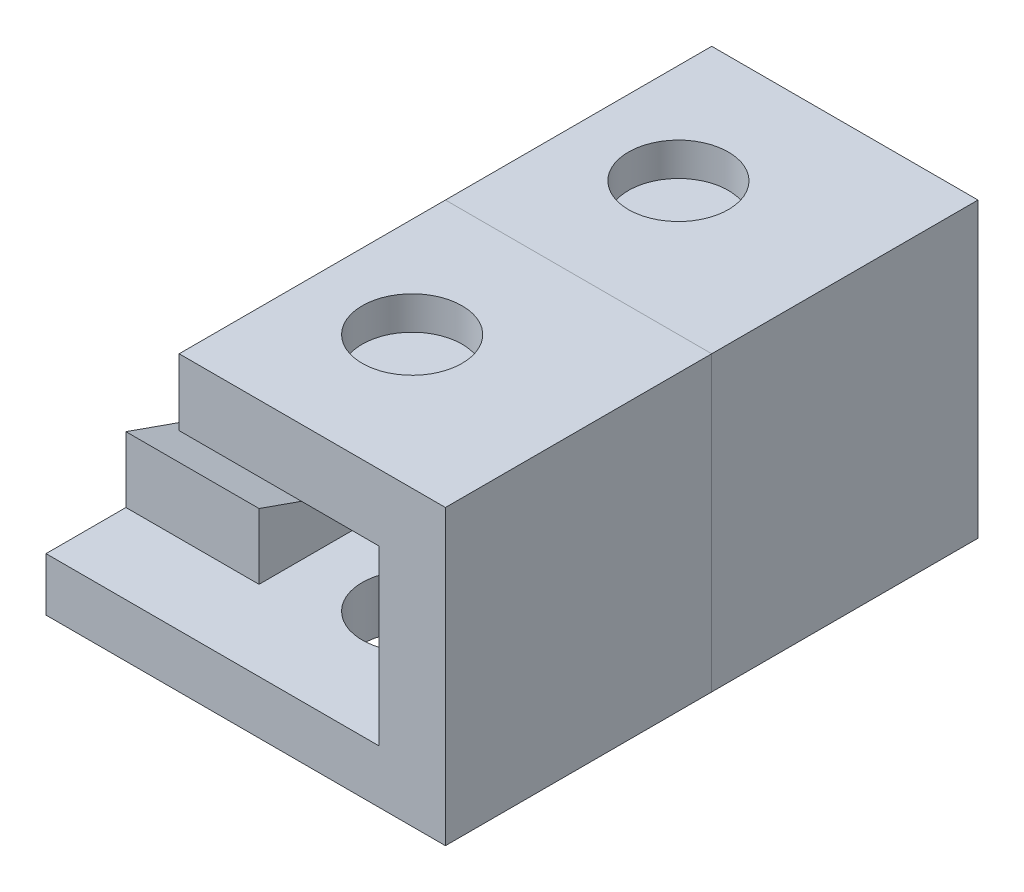
ISO-10303-21;
HEADER;
FILE_DESCRIPTION(('STEP AP214'),'2;1');
FILE_NAME('part.step','',(''),(''),'','','');
FILE_SCHEMA(('AUTOMOTIVE_DESIGN { 1 0 10303 214 1 1 1 1 }'));
ENDSEC;
DATA;
#1=APPLICATION_CONTEXT('core data for automotive mechanical design processes');
#2=APPLICATION_PROTOCOL_DEFINITION('international standard','automotive_design',2000,#1);
#3=PRODUCT_CONTEXT('',#1,'mechanical');
#4=PRODUCT('Part','Part','',(#3));
#5=PRODUCT_RELATED_PRODUCT_CATEGORY('part','',(#4));
#6=PRODUCT_DEFINITION_FORMATION('','',#4);
#7=PRODUCT_DEFINITION_CONTEXT('part definition',#1,'design');
#8=PRODUCT_DEFINITION('design','',#6,#7);
#9=PRODUCT_DEFINITION_SHAPE('','',#8);
#10=(LENGTH_UNIT() NAMED_UNIT(*) SI_UNIT(.MILLI.,.METRE.));
#11=(NAMED_UNIT(*) PLANE_ANGLE_UNIT() SI_UNIT($,.RADIAN.));
#12=(NAMED_UNIT(*) SI_UNIT($,.STERADIAN.) SOLID_ANGLE_UNIT());
#13=UNCERTAINTY_MEASURE_WITH_UNIT(LENGTH_MEASURE(1.E-05),#10,'distance_accuracy_value','');
#14=(GEOMETRIC_REPRESENTATION_CONTEXT(3) GLOBAL_UNCERTAINTY_ASSIGNED_CONTEXT((#13)) GLOBAL_UNIT_ASSIGNED_CONTEXT((#10,
#11,#12)) REPRESENTATION_CONTEXT('',''));
#15=CARTESIAN_POINT('',(0.,0.,0.));
#16=DIRECTION('',(0.,0.,1.));
#17=DIRECTION('',(1.,0.,0.));
#18=AXIS2_PLACEMENT_3D('',#15,#16,#17);
#19=CARTESIAN_POINT('',(31.75,-2.54,0.));
#20=DIRECTION('',(1.,0.,0.));
#21=DIRECTION('',(0.,0.,1.));
#22=AXIS2_PLACEMENT_3D('',#19,#20,#21);
#23=PLANE('',#22);
#24=DIRECTION('',(0.,0.,-1.));
#25=VECTOR('',#24,1.);
#26=CARTESIAN_POINT('',(31.75,19.05,25.4));
#27=LINE('',#26,#25);
#28=CARTESIAN_POINT('',(31.75,19.05,25.4));
#29=VERTEX_POINT('',#28);
#30=CARTESIAN_POINT('',(31.75,19.05,0.));
#31=VERTEX_POINT('',#30);
#32=EDGE_CURVE('E205',#29,#31,#27,.T.);
#33=ORIENTED_EDGE('',*,*,#32,.T.);
#34=DIRECTION('',(0.,1.,0.));
#35=VECTOR('',#34,1.);
#36=CARTESIAN_POINT('',(31.75,-2.54,0.));
#37=LINE('',#36,#35);
#38=CARTESIAN_POINT('',(31.75,2.54,0.));
#39=VERTEX_POINT('',#38);
#40=EDGE_CURVE('E239',#39,#31,#37,.T.);
#41=ORIENTED_EDGE('',*,*,#40,.F.);
#42=DIRECTION('',(0.,0.,1.));
#43=VECTOR('',#42,1.);
#44=CARTESIAN_POINT('',(31.75,2.54,0.));
#45=LINE('',#44,#43);
#46=CARTESIAN_POINT('',(31.75,2.54,25.4));
#47=VERTEX_POINT('',#46);
#48=EDGE_CURVE('E266',#39,#47,#45,.T.);
#49=ORIENTED_EDGE('',*,*,#48,.T.);
#50=DIRECTION('',(0.,1.,0.));
#51=VECTOR('',#50,1.);
#52=CARTESIAN_POINT('',(31.75,-2.54,25.4));
#53=LINE('',#52,#51);
#54=EDGE_CURVE('E242',#47,#29,#53,.T.);
#55=ORIENTED_EDGE('',*,*,#54,.T.);
#56=EDGE_LOOP('',(#33,#41,#49,#55));
#57=FACE_BOUND('',#56,.T.);
#58=ADVANCED_FACE('F101',(#57),#23,.F.);
#59=CARTESIAN_POINT('',(0.,-2.54,25.4));
#60=DIRECTION('',(0.,0.,-1.));
#61=DIRECTION('',(1.,0.,0.));
#62=AXIS2_PLACEMENT_3D('',#59,#60,#61);
#63=PLANE('',#62);
#64=DIRECTION('',(1.,0.,0.));
#65=VECTOR('',#64,1.);
#66=CARTESIAN_POINT('',(0.,-2.54,25.4));
#67=LINE('',#66,#65);
#68=CARTESIAN_POINT('',(0.,-2.54,25.4));
#69=VERTEX_POINT('',#68);
#70=CARTESIAN_POINT('',(38.1,-2.54,25.4));
#71=VERTEX_POINT('',#70);
#72=EDGE_CURVE('E109',#69,#71,#67,.T.);
#73=ORIENTED_EDGE('',*,*,#72,.T.);
#74=DIRECTION('',(0.,1.,0.));
#75=VECTOR('',#74,1.);
#76=CARTESIAN_POINT('',(38.1,-2.54,25.4));
#77=LINE('',#76,#75);
#78=CARTESIAN_POINT('',(38.1,25.4,25.4));
#79=VERTEX_POINT('',#78);
#80=EDGE_CURVE('E234',#71,#79,#77,.T.);
#81=ORIENTED_EDGE('',*,*,#80,.T.);
#82=DIRECTION('',(1.,0.,0.));
#83=VECTOR('',#82,1.);
#84=CARTESIAN_POINT('',(0.,25.4,25.4));
#85=LINE('',#84,#83);
#86=CARTESIAN_POINT('',(12.7,25.4,25.4));
#87=VERTEX_POINT('',#86);
#88=EDGE_CURVE('E226',#87,#79,#85,.T.);
#89=ORIENTED_EDGE('',*,*,#88,.F.);
#90=DIRECTION('',(0.,-1.,0.));
#91=VECTOR('',#90,1.);
#92=CARTESIAN_POINT('',(12.7,25.4,25.4));
#93=LINE('',#92,#91);
#94=CARTESIAN_POINT('',(12.7,19.05,25.4));
#95=VERTEX_POINT('',#94);
#96=EDGE_CURVE('E208',#87,#95,#93,.T.);
#97=ORIENTED_EDGE('',*,*,#96,.T.);
#98=DIRECTION('',(1.,0.,0.));
#99=VECTOR('',#98,1.);
#100=CARTESIAN_POINT('',(12.7,19.05,25.4));
#101=LINE('',#100,#99);
#102=EDGE_CURVE('E222',#95,#29,#101,.T.);
#103=ORIENTED_EDGE('',*,*,#102,.T.);
#104=ORIENTED_EDGE('',*,*,#54,.F.);
#105=DIRECTION('',(1.,0.,0.));
#106=VECTOR('',#105,1.);
#107=CARTESIAN_POINT('',(0.,2.54,25.4));
#108=LINE('',#107,#106);
#109=CARTESIAN_POINT('',(0.,2.54,25.4));
#110=VERTEX_POINT('',#109);
#111=EDGE_CURVE('E260',#110,#47,#108,.T.);
#112=ORIENTED_EDGE('',*,*,#111,.F.);
#113=DIRECTION('',(0.,-1.,0.));
#114=VECTOR('',#113,1.);
#115=CARTESIAN_POINT('',(0.,2.54,25.4));
#116=LINE('',#115,#114);
#117=EDGE_CURVE('E254',#110,#69,#116,.T.);
#118=ORIENTED_EDGE('',*,*,#117,.T.);
#119=EDGE_LOOP('',(#73,#81,#89,#97,#103,#104,#112,#118));
#120=FACE_BOUND('',#119,.T.);
#121=ADVANCED_FACE('F274',(#120),#63,.F.);
#122=CARTESIAN_POINT('',(0.,-2.54,0.));
#123=DIRECTION('',(0.,0.,-1.));
#124=DIRECTION('',(1.,0.,0.));
#125=AXIS2_PLACEMENT_3D('',#122,#123,#124);
#126=PLANE('',#125);
#127=DIRECTION('',(1.,0.,0.));
#128=VECTOR('',#127,1.);
#129=CARTESIAN_POINT('',(0.,-2.54,0.));
#130=LINE('',#129,#128);
#131=CARTESIAN_POINT('',(0.,-2.54,0.));
#132=VERTEX_POINT('',#131);
#133=CARTESIAN_POINT('',(38.1,-2.54,0.));
#134=VERTEX_POINT('',#133);
#135=EDGE_CURVE('E13',#132,#134,#130,.T.);
#136=ORIENTED_EDGE('',*,*,#135,.F.);
#137=DIRECTION('',(0.,-1.,0.));
#138=VECTOR('',#137,1.);
#139=CARTESIAN_POINT('',(0.,2.54,0.));
#140=LINE('',#139,#138);
#141=CARTESIAN_POINT('',(0.,2.54,0.));
#142=VERTEX_POINT('',#141);
#143=EDGE_CURVE('E251',#142,#132,#140,.T.);
#144=ORIENTED_EDGE('',*,*,#143,.F.);
#145=DIRECTION('',(1.,0.,0.));
#146=VECTOR('',#145,1.);
#147=CARTESIAN_POINT('',(0.,2.54,0.));
#148=LINE('',#147,#146);
#149=CARTESIAN_POINT('',(12.7,2.54,0.));
#150=VERTEX_POINT('',#149);
#151=EDGE_CURVE('E263',#142,#150,#148,.T.);
#152=ORIENTED_EDGE('',*,*,#151,.T.);
#153=EDGE_CURVE('E262',#150,#39,#148,.T.);
#154=ORIENTED_EDGE('',*,*,#153,.T.);
#155=ORIENTED_EDGE('',*,*,#40,.T.);
#156=DIRECTION('',(1.,0.,0.));
#157=VECTOR('',#156,1.);
#158=CARTESIAN_POINT('',(12.7,19.05,0.));
#159=LINE('',#158,#157);
#160=CARTESIAN_POINT('',(12.7,19.05,0.));
#161=VERTEX_POINT('',#160);
#162=EDGE_CURVE('E218',#161,#31,#159,.T.);
#163=ORIENTED_EDGE('',*,*,#162,.F.);
#164=DIRECTION('',(0.,1.,0.));
#165=VECTOR('',#164,1.);
#166=CARTESIAN_POINT('',(12.7,25.4,0.));
#167=LINE('',#166,#165);
#168=CARTESIAN_POINT('',(12.7,25.4,0.));
#169=VERTEX_POINT('',#168);
#170=EDGE_CURVE('E213',#161,#169,#167,.T.);
#171=ORIENTED_EDGE('',*,*,#170,.T.);
#172=DIRECTION('',(1.,0.,0.));
#173=VECTOR('',#172,1.);
#174=CARTESIAN_POINT('',(0.,25.4,0.));
#175=LINE('',#174,#173);
#176=CARTESIAN_POINT('',(38.1,25.4,0.));
#177=VERTEX_POINT('',#176);
#178=EDGE_CURVE('E229',#169,#177,#175,.T.);
#179=ORIENTED_EDGE('',*,*,#178,.T.);
#180=DIRECTION('',(0.,1.,0.));
#181=VECTOR('',#180,1.);
#182=CARTESIAN_POINT('',(38.1,-2.54,0.));
#183=LINE('',#182,#181);
#184=EDGE_CURVE('E235',#134,#177,#183,.T.);
#185=ORIENTED_EDGE('',*,*,#184,.F.);
#186=EDGE_LOOP('',(#136,#144,#152,#154,#155,#163,#171,#179,#185));
#187=FACE_BOUND('',#186,.T.);
#188=ADVANCED_FACE('F308',(#187),#126,.T.);
#189=CARTESIAN_POINT('',(22.225,-2.54,12.7));
#190=DIRECTION('',(0.,1.,0.));
#191=DIRECTION('',(0.,0.,-1.));
#192=AXIS2_PLACEMENT_3D('',#189,#190,#191);
#193=CYLINDRICAL_SURFACE('',#192,4.7625);
#194=CARTESIAN_POINT('',(22.225,-2.54,12.7));
#195=DIRECTION('',(0.,-1.,0.));
#196=DIRECTION('',(0.,0.,-1.));
#197=AXIS2_PLACEMENT_3D('',#194,#195,#196);
#198=CIRCLE('',#197,4.7625);
#199=CARTESIAN_POINT('',(22.225,-2.54,7.9375));
#200=VERTEX_POINT('',#199);
#201=EDGE_CURVE('E269',#200,#200,#198,.T.);
#202=ORIENTED_EDGE('',*,*,#201,.T.);
#203=EDGE_LOOP('',(#202));
#204=FACE_BOUND('',#203,.T.);
#205=CARTESIAN_POINT('',(22.225,2.54,12.7));
#206=DIRECTION('',(0.,-1.,0.));
#207=DIRECTION('',(0.,0.,-1.));
#208=AXIS2_PLACEMENT_3D('',#205,#206,#207);
#209=CIRCLE('',#208,4.7625);
#210=CARTESIAN_POINT('',(22.225,2.54,7.9375));
#211=VERTEX_POINT('',#210);
#212=EDGE_CURVE('E257',#211,#211,#209,.T.);
#213=ORIENTED_EDGE('',*,*,#212,.F.);
#214=EDGE_LOOP('',(#213));
#215=FACE_BOUND('',#214,.T.);
#216=ADVANCED_FACE('F103',(#204,#215),#193,.F.);
#217=CARTESIAN_POINT('',(0.,-2.54,0.));
#218=DIRECTION('',(0.,1.,0.));
#219=DIRECTION('',(0.,0.,-1.));
#220=AXIS2_PLACEMENT_3D('',#217,#218,#219);
#221=PLANE('',#220);
#222=ORIENTED_EDGE('',*,*,#201,.F.);
#223=EDGE_LOOP('',(#222));
#224=FACE_BOUND('',#223,.T.);
#225=ORIENTED_EDGE('',*,*,#72,.F.);
#226=DIRECTION('',(0.,0.,-1.));
#227=VECTOR('',#226,1.);
#228=CARTESIAN_POINT('',(0.,-2.54,25.4));
#229=LINE('',#228,#227);
#230=EDGE_CURVE('E238',#69,#132,#229,.T.);
#231=ORIENTED_EDGE('',*,*,#230,.T.);
#232=ORIENTED_EDGE('',*,*,#135,.T.);
#233=DIRECTION('',(0.,0.,-1.));
#234=VECTOR('',#233,1.);
#235=CARTESIAN_POINT('',(38.1,-2.54,0.));
#236=LINE('',#235,#234);
#237=EDGE_CURVE('E232',#71,#134,#236,.T.);
#238=ORIENTED_EDGE('',*,*,#237,.F.);
#239=EDGE_LOOP('',(#225,#231,#232,#238));
#240=FACE_BOUND('',#239,.T.);
#241=ADVANCED_FACE('F280',(#224,#240),#221,.F.);
#242=CARTESIAN_POINT('',(0.,2.54,0.));
#243=DIRECTION('',(0.,1.,0.));
#244=DIRECTION('',(0.,0.,-1.));
#245=AXIS2_PLACEMENT_3D('',#242,#243,#244);
#246=PLANE('',#245);
#247=DIRECTION('',(-1.,0.,0.));
#248=VECTOR('',#247,1.);
#249=CARTESIAN_POINT('',(12.7,2.54,17.7786016365956));
#250=LINE('',#249,#248);
#251=CARTESIAN_POINT('',(12.7,2.54,17.7786016365956));
#252=VERTEX_POINT('',#251);
#253=CARTESIAN_POINT('',(0.,2.54,17.7786016365956));
#254=VERTEX_POINT('',#253);
#255=EDGE_CURVE('E189',#252,#254,#250,.T.);
#256=ORIENTED_EDGE('',*,*,#255,.T.);
#257=DIRECTION('',(0.,0.,-1.));
#258=VECTOR('',#257,1.);
#259=CARTESIAN_POINT('',(0.,2.54,25.4));
#260=LINE('',#259,#258);
#261=EDGE_CURVE('E248',#110,#254,#260,.T.);
#262=ORIENTED_EDGE('',*,*,#261,.F.);
#263=ORIENTED_EDGE('',*,*,#111,.T.);
#264=ORIENTED_EDGE('',*,*,#48,.F.);
#265=ORIENTED_EDGE('',*,*,#153,.F.);
#266=DIRECTION('',(0.,0.,-1.));
#267=VECTOR('',#266,1.);
#268=CARTESIAN_POINT('',(12.7,2.54,17.7786016365956));
#269=LINE('',#268,#267);
#270=EDGE_CURVE('E180',#252,#150,#269,.T.);
#271=ORIENTED_EDGE('',*,*,#270,.F.);
#272=EDGE_LOOP('',(#256,#262,#263,#264,#265,#271));
#273=FACE_BOUND('',#272,.T.);
#274=ORIENTED_EDGE('',*,*,#212,.T.);
#275=EDGE_LOOP('',(#274));
#276=FACE_BOUND('',#275,.T.);
#277=ADVANCED_FACE('F302',(#273,#276),#246,.T.);
#278=CARTESIAN_POINT('',(0.,2.54,25.4));
#279=DIRECTION('',(1.,0.,0.));
#280=DIRECTION('',(0.,0.,1.));
#281=AXIS2_PLACEMENT_3D('',#278,#279,#280);
#282=PLANE('',#281);
#283=ORIENTED_EDGE('',*,*,#143,.T.);
#284=ORIENTED_EDGE('',*,*,#230,.F.);
#285=ORIENTED_EDGE('',*,*,#117,.F.);
#286=ORIENTED_EDGE('',*,*,#261,.T.);
#287=DIRECTION('',(0.,-1.,0.));
#288=VECTOR('',#287,1.);
#289=CARTESIAN_POINT('',(0.,2.54,17.7786016365956));
#290=LINE('',#289,#288);
#291=CARTESIAN_POINT('',(0.,8.80513772784752,17.7786016365956));
#292=VERTEX_POINT('',#291);
#293=EDGE_CURVE('E198',#292,#254,#290,.T.);
#294=ORIENTED_EDGE('',*,*,#293,.F.);
#295=DIRECTION('',(0.,0.332364248343034,0.943151104767084));
#296=VECTOR('',#295,1.);
#297=CARTESIAN_POINT('',(0.,8.80513772784752,17.7786016365956));
#298=LINE('',#297,#296);
#299=EDGE_CURVE('E186',#142,#292,#298,.T.);
#300=ORIENTED_EDGE('',*,*,#299,.F.);
#301=EDGE_LOOP('',(#283,#284,#285,#286,#294,#300));
#302=FACE_BOUND('',#301,.T.);
#303=ADVANCED_FACE('F305',(#302),#282,.F.);
#304=CARTESIAN_POINT('',(38.1,-2.54,0.));
#305=DIRECTION('',(-1.,0.,0.));
#306=DIRECTION('',(0.,0.,-1.));
#307=AXIS2_PLACEMENT_3D('',#304,#305,#306);
#308=PLANE('',#307);
#309=ORIENTED_EDGE('',*,*,#80,.F.);
#310=ORIENTED_EDGE('',*,*,#237,.T.);
#311=ORIENTED_EDGE('',*,*,#184,.T.);
#312=DIRECTION('',(0.,0.,-1.));
#313=VECTOR('',#312,1.);
#314=CARTESIAN_POINT('',(38.1,25.4,0.));
#315=LINE('',#314,#313);
#316=EDGE_CURVE('E224',#79,#177,#315,.T.);
#317=ORIENTED_EDGE('',*,*,#316,.F.);
#318=EDGE_LOOP('',(#309,#310,#311,#317));
#319=FACE_BOUND('',#318,.T.);
#320=ADVANCED_FACE('F284',(#319),#308,.F.);
#321=CARTESIAN_POINT('',(0.,25.4,0.));
#322=DIRECTION('',(0.,1.,0.));
#323=DIRECTION('',(0.,0.,-1.));
#324=AXIS2_PLACEMENT_3D('',#321,#322,#323);
#325=PLANE('',#324);
#326=CARTESIAN_POINT('',(22.225,25.4,12.7));
#327=DIRECTION('',(0.,-1.,0.));
#328=DIRECTION('',(0.,0.,-1.));
#329=AXIS2_PLACEMENT_3D('',#326,#327,#328);
#330=CIRCLE('',#329,4.7625);
#331=CARTESIAN_POINT('',(22.225,25.4,7.9375));
#332=VERTEX_POINT('',#331);
#333=EDGE_CURVE('E200',#332,#332,#330,.T.);
#334=ORIENTED_EDGE('',*,*,#333,.T.);
#335=EDGE_LOOP('',(#334));
#336=FACE_BOUND('',#335,.T.);
#337=ORIENTED_EDGE('',*,*,#316,.T.);
#338=ORIENTED_EDGE('',*,*,#178,.F.);
#339=DIRECTION('',(0.,0.,1.));
#340=VECTOR('',#339,1.);
#341=CARTESIAN_POINT('',(12.7,25.4,25.4));
#342=LINE('',#341,#340);
#343=EDGE_CURVE('E216',#169,#87,#342,.T.);
#344=ORIENTED_EDGE('',*,*,#343,.T.);
#345=ORIENTED_EDGE('',*,*,#88,.T.);
#346=EDGE_LOOP('',(#337,#338,#344,#345));
#347=FACE_BOUND('',#346,.T.);
#348=ADVANCED_FACE('F287',(#336,#347),#325,.T.);
#349=CARTESIAN_POINT('',(12.7,19.05,25.4));
#350=DIRECTION('',(0.,1.,0.));
#351=DIRECTION('',(0.,0.,-1.));
#352=AXIS2_PLACEMENT_3D('',#349,#350,#351);
#353=PLANE('',#352);
#354=ORIENTED_EDGE('',*,*,#32,.F.);
#355=ORIENTED_EDGE('',*,*,#102,.F.);
#356=DIRECTION('',(0.,0.,-1.));
#357=VECTOR('',#356,1.);
#358=CARTESIAN_POINT('',(12.7,19.05,25.4));
#359=LINE('',#358,#357);
#360=EDGE_CURVE('E211',#95,#161,#359,.T.);
#361=ORIENTED_EDGE('',*,*,#360,.T.);
#362=ORIENTED_EDGE('',*,*,#162,.T.);
#363=EDGE_LOOP('',(#354,#355,#361,#362));
#364=FACE_BOUND('',#363,.T.);
#365=ADVANCED_FACE('F297',(#364),#353,.F.);
#366=CARTESIAN_POINT('',(12.7,0.,0.));
#367=DIRECTION('',(-1.,0.,0.));
#368=DIRECTION('',(0.,0.,-1.));
#369=AXIS2_PLACEMENT_3D('',#366,#367,#368);
#370=PLANE('',#369);
#371=ORIENTED_EDGE('',*,*,#96,.F.);
#372=ORIENTED_EDGE('',*,*,#343,.F.);
#373=ORIENTED_EDGE('',*,*,#170,.F.);
#374=ORIENTED_EDGE('',*,*,#360,.F.);
#375=EDGE_LOOP('',(#371,#372,#373,#374));
#376=FACE_BOUND('',#375,.T.);
#377=ADVANCED_FACE('F292',(#376),#370,.T.);
#378=CARTESIAN_POINT('',(22.225,22.225,12.7));
#379=DIRECTION('',(0.,1.,0.));
#380=DIRECTION('',(0.,0.,-1.));
#381=AXIS2_PLACEMENT_3D('',#378,#379,#380);
#382=CYLINDRICAL_SURFACE('',#381,4.7625);
#383=CARTESIAN_POINT('',(22.225,22.225,12.7));
#384=DIRECTION('',(0.,-1.,0.));
#385=DIRECTION('',(0.,0.,-1.));
#386=AXIS2_PLACEMENT_3D('',#383,#384,#385);
#387=CIRCLE('',#386,4.7625);
#388=CARTESIAN_POINT('',(22.225,22.225,7.9375));
#389=VERTEX_POINT('',#388);
#390=EDGE_CURVE('E202',#389,#389,#387,.T.);
#391=ORIENTED_EDGE('',*,*,#390,.T.);
#392=EDGE_LOOP('',(#391));
#393=FACE_BOUND('',#392,.T.);
#394=ORIENTED_EDGE('',*,*,#333,.F.);
#395=EDGE_LOOP('',(#394));
#396=FACE_BOUND('',#395,.T.);
#397=ADVANCED_FACE('F367',(#393,#396),#382,.F.);
#398=CARTESIAN_POINT('',(22.225,22.225,12.7));
#399=DIRECTION('',(0.,1.,0.));
#400=DIRECTION('',(0.,0.,-1.));
#401=AXIS2_PLACEMENT_3D('',#398,#399,#400);
#402=PLANE('',#401);
#403=ORIENTED_EDGE('',*,*,#390,.F.);
#404=EDGE_LOOP('',(#403));
#405=FACE_BOUND('',#404,.T.);
#406=ADVANCED_FACE('F374',(#405),#402,.T.);
#407=CARTESIAN_POINT('',(12.7,2.54,17.7786016365956));
#408=DIRECTION('',(0.,0.,1.));
#409=DIRECTION('',(-1.,0.,0.));
#410=AXIS2_PLACEMENT_3D('',#407,#408,#409);
#411=PLANE('',#410);
#412=ORIENTED_EDGE('',*,*,#293,.T.);
#413=ORIENTED_EDGE('',*,*,#255,.F.);
#414=DIRECTION('',(0.,-1.,0.));
#415=VECTOR('',#414,1.);
#416=CARTESIAN_POINT('',(12.7,2.54,17.7786016365956));
#417=LINE('',#416,#415);
#418=CARTESIAN_POINT('',(12.7,8.80513772784752,17.7786016365956));
#419=VERTEX_POINT('',#418);
#420=EDGE_CURVE('E116',#419,#252,#417,.T.);
#421=ORIENTED_EDGE('',*,*,#420,.F.);
#422=DIRECTION('',(-1.,0.,0.));
#423=VECTOR('',#422,1.);
#424=CARTESIAN_POINT('',(12.7,8.80513772784752,17.7786016365956));
#425=LINE('',#424,#423);
#426=EDGE_CURVE('E184',#419,#292,#425,.T.);
#427=ORIENTED_EDGE('',*,*,#426,.T.);
#428=EDGE_LOOP('',(#412,#413,#421,#427));
#429=FACE_BOUND('',#428,.T.);
#430=ADVANCED_FACE('F192',(#429),#411,.T.);
#431=CARTESIAN_POINT('',(12.7,8.80513772784752,17.7786016365956));
#432=DIRECTION('',(0.,0.943151104767084,-0.332364248343034));
#433=DIRECTION('',(0.,-0.332364248343034,-0.943151104767084));
#434=AXIS2_PLACEMENT_3D('',#431,#432,#433);
#435=PLANE('',#434);
#436=ORIENTED_EDGE('',*,*,#299,.T.);
#437=ORIENTED_EDGE('',*,*,#426,.F.);
#438=DIRECTION('',(0.,0.332364248343034,0.943151104767084));
#439=VECTOR('',#438,1.);
#440=CARTESIAN_POINT('',(12.7,8.80513772784752,17.7786016365956));
#441=LINE('',#440,#439);
#442=EDGE_CURVE('E123',#150,#419,#441,.T.);
#443=ORIENTED_EDGE('',*,*,#442,.F.);
#444=ORIENTED_EDGE('',*,*,#151,.F.);
#445=EDGE_LOOP('',(#436,#437,#443,#444));
#446=FACE_BOUND('',#445,.T.);
#447=ADVANCED_FACE('F185',(#446),#435,.T.);
#448=CARTESIAN_POINT('',(12.7,0.,0.));
#449=DIRECTION('',(-1.,0.,0.));
#450=DIRECTION('',(0.,0.,-1.));
#451=AXIS2_PLACEMENT_3D('',#448,#449,#450);
#452=PLANE('',#451);
#453=ORIENTED_EDGE('',*,*,#270,.T.);
#454=ORIENTED_EDGE('',*,*,#442,.T.);
#455=ORIENTED_EDGE('',*,*,#420,.T.);
#456=EDGE_LOOP('',(#453,#454,#455));
#457=FACE_BOUND('',#456,.T.);
#458=ADVANCED_FACE('F179',(#457),#452,.F.);
#459=CLOSED_SHELL('',(#58,#121,#188,#216,#241,#277,#303,#320,#348,#365,#377,#397,#406,#430,#447,#458));
#460=MANIFOLD_SOLID_BREP('B2_NOT_SHOWN',#459);
#461=CARTESIAN_POINT('',(31.75,-2.54,0.));
#462=DIRECTION('',(1.,0.,0.));
#463=DIRECTION('',(0.,0.,-1.));
#464=AXIS2_PLACEMENT_3D('',#461,#462,#463);
#465=PLANE('',#464);
#466=DIRECTION('',(0.,0.,1.));
#467=VECTOR('',#466,1.);
#468=CARTESIAN_POINT('',(31.75,19.05,-25.4));
#469=LINE('',#468,#467);
#470=CARTESIAN_POINT('',(31.75,19.05,-25.4));
#471=VERTEX_POINT('',#470);
#472=CARTESIAN_POINT('',(31.75,19.05,0.));
#473=VERTEX_POINT('',#472);
#474=EDGE_CURVE('E603',#471,#473,#469,.T.);
#475=ORIENTED_EDGE('',*,*,#474,.F.);
#476=DIRECTION('',(0.,1.,0.));
#477=VECTOR('',#476,1.);
#478=CARTESIAN_POINT('',(31.75,-2.54,-25.4));
#479=LINE('',#478,#477);
#480=CARTESIAN_POINT('',(31.75,2.54,-25.4));
#481=VERTEX_POINT('',#480);
#482=EDGE_CURVE('E657',#481,#471,#479,.T.);
#483=ORIENTED_EDGE('',*,*,#482,.F.);
#484=DIRECTION('',(0.,0.,-1.));
#485=VECTOR('',#484,1.);
#486=CARTESIAN_POINT('',(31.75,2.54,0.));
#487=LINE('',#486,#485);
#488=CARTESIAN_POINT('',(31.75,2.54,0.));
#489=VERTEX_POINT('',#488);
#490=EDGE_CURVE('E687',#489,#481,#487,.T.);
#491=ORIENTED_EDGE('',*,*,#490,.F.);
#492=DIRECTION('',(0.,1.,0.));
#493=VECTOR('',#492,1.);
#494=CARTESIAN_POINT('',(31.75,-2.54,0.));
#495=LINE('',#494,#493);
#496=EDGE_CURVE('E654',#489,#473,#495,.T.);
#497=ORIENTED_EDGE('',*,*,#496,.T.);
#498=EDGE_LOOP('',(#475,#483,#491,#497));
#499=FACE_BOUND('',#498,.T.);
#500=ADVANCED_FACE('F487',(#499),#465,.F.);
#501=CARTESIAN_POINT('',(0.,-2.54,-25.4));
#502=DIRECTION('',(0.,0.,1.));
#503=DIRECTION('',(1.,0.,0.));
#504=AXIS2_PLACEMENT_3D('',#501,#502,#503);
#505=PLANE('',#504);
#506=DIRECTION('',(1.,0.,0.));
#507=VECTOR('',#506,1.);
#508=CARTESIAN_POINT('',(0.,-2.54,-25.4));
#509=LINE('',#508,#507);
#510=CARTESIAN_POINT('',(0.,-2.54,-25.4));
#511=VERTEX_POINT('',#510);
#512=CARTESIAN_POINT('',(38.1,-2.54,-25.4));
#513=VERTEX_POINT('',#512);
#514=EDGE_CURVE('E496',#511,#513,#509,.T.);
#515=ORIENTED_EDGE('',*,*,#514,.F.);
#516=DIRECTION('',(0.,-1.,0.));
#517=VECTOR('',#516,1.);
#518=CARTESIAN_POINT('',(0.,2.54,-25.4));
#519=LINE('',#518,#517);
#520=CARTESIAN_POINT('',(0.,2.54,-25.4));
#521=VERTEX_POINT('',#520);
#522=EDGE_CURVE('E672',#521,#511,#519,.T.);
#523=ORIENTED_EDGE('',*,*,#522,.F.);
#524=DIRECTION('',(1.,0.,0.));
#525=VECTOR('',#524,1.);
#526=CARTESIAN_POINT('',(0.,2.54,-25.4));
#527=LINE('',#526,#525);
#528=EDGE_CURVE('E680',#521,#481,#527,.T.);
#529=ORIENTED_EDGE('',*,*,#528,.T.);
#530=ORIENTED_EDGE('',*,*,#482,.T.);
#531=DIRECTION('',(1.,0.,0.));
#532=VECTOR('',#531,1.);
#533=CARTESIAN_POINT('',(12.7,19.05,-25.4));
#534=LINE('',#533,#532);
#535=CARTESIAN_POINT('',(12.7,19.05,-25.4));
#536=VERTEX_POINT('',#535);
#537=EDGE_CURVE('E629',#536,#471,#534,.T.);
#538=ORIENTED_EDGE('',*,*,#537,.F.);
#539=DIRECTION('',(0.,-1.,0.));
#540=VECTOR('',#539,1.);
#541=CARTESIAN_POINT('',(12.7,25.4,-25.4));
#542=LINE('',#541,#540);
#543=CARTESIAN_POINT('',(12.7,25.4,-25.4));
#544=VERTEX_POINT('',#543);
#545=EDGE_CURVE('E607',#544,#536,#542,.T.);
#546=ORIENTED_EDGE('',*,*,#545,.F.);
#547=DIRECTION('',(1.,0.,0.));
#548=VECTOR('',#547,1.);
#549=CARTESIAN_POINT('',(0.,25.4,-25.4));
#550=LINE('',#549,#548);
#551=CARTESIAN_POINT('',(38.1,25.4,-25.4));
#552=VERTEX_POINT('',#551);
#553=EDGE_CURVE('E637',#544,#552,#550,.T.);
#554=ORIENTED_EDGE('',*,*,#553,.T.);
#555=DIRECTION('',(0.,1.,0.));
#556=VECTOR('',#555,1.);
#557=CARTESIAN_POINT('',(38.1,-2.54,-25.4));
#558=LINE('',#557,#556);
#559=EDGE_CURVE('E649',#513,#552,#558,.T.);
#560=ORIENTED_EDGE('',*,*,#559,.F.);
#561=EDGE_LOOP('',(#515,#523,#529,#530,#538,#546,#554,#560));
#562=FACE_BOUND('',#561,.T.);
#563=ADVANCED_FACE('F704',(#562),#505,.F.);
#564=CARTESIAN_POINT('',(0.,-2.54,0.));
#565=DIRECTION('',(0.,0.,1.));
#566=DIRECTION('',(1.,0.,0.));
#567=AXIS2_PLACEMENT_3D('',#564,#565,#566);
#568=PLANE('',#567);
#569=DIRECTION('',(1.,0.,0.));
#570=VECTOR('',#569,1.);
#571=CARTESIAN_POINT('',(0.,-2.54,0.));
#572=LINE('',#571,#570);
#573=CARTESIAN_POINT('',(0.,-2.54,0.));
#574=VERTEX_POINT('',#573);
#575=CARTESIAN_POINT('',(38.1,-2.54,0.));
#576=VERTEX_POINT('',#575);
#577=EDGE_CURVE('E99',#574,#576,#572,.T.);
#578=ORIENTED_EDGE('',*,*,#577,.T.);
#579=DIRECTION('',(0.,1.,0.));
#580=VECTOR('',#579,1.);
#581=CARTESIAN_POINT('',(38.1,-2.54,0.));
#582=LINE('',#581,#580);
#583=CARTESIAN_POINT('',(38.1,25.4,0.));
#584=VERTEX_POINT('',#583);
#585=EDGE_CURVE('E650',#576,#584,#582,.T.);
#586=ORIENTED_EDGE('',*,*,#585,.T.);
#587=DIRECTION('',(1.,0.,0.));
#588=VECTOR('',#587,1.);
#589=CARTESIAN_POINT('',(0.,25.4,0.));
#590=LINE('',#589,#588);
#591=CARTESIAN_POINT('',(12.7,25.4,0.));
#592=VERTEX_POINT('',#591);
#593=EDGE_CURVE('E641',#592,#584,#590,.T.);
#594=ORIENTED_EDGE('',*,*,#593,.F.);
#595=DIRECTION('',(0.,1.,0.));
#596=VECTOR('',#595,1.);
#597=CARTESIAN_POINT('',(12.7,25.4,0.));
#598=LINE('',#597,#596);
#599=CARTESIAN_POINT('',(12.7,19.05,0.));
#600=VERTEX_POINT('',#599);
#601=EDGE_CURVE('E614',#600,#592,#598,.T.);
#602=ORIENTED_EDGE('',*,*,#601,.F.);
#603=DIRECTION('',(1.,0.,0.));
#604=VECTOR('',#603,1.);
#605=CARTESIAN_POINT('',(12.7,19.05,0.));
#606=LINE('',#605,#604);
#607=EDGE_CURVE('E622',#600,#473,#606,.T.);
#608=ORIENTED_EDGE('',*,*,#607,.T.);
#609=ORIENTED_EDGE('',*,*,#496,.F.);
#610=DIRECTION('',(1.,0.,0.));
#611=VECTOR('',#610,1.);
#612=CARTESIAN_POINT('',(0.,2.54,0.));
#613=LINE('',#612,#611);
#614=CARTESIAN_POINT('',(12.7,2.54,0.));
#615=VERTEX_POINT('',#614);
#616=EDGE_CURVE('E684',#615,#489,#613,.T.);
#617=ORIENTED_EDGE('',*,*,#616,.F.);
#618=CARTESIAN_POINT('',(0.,2.54,0.));
#619=VERTEX_POINT('',#618);
#620=EDGE_CURVE('E582',#619,#615,#613,.T.);
#621=ORIENTED_EDGE('',*,*,#620,.F.);
#622=DIRECTION('',(0.,-1.,0.));
#623=VECTOR('',#622,1.);
#624=CARTESIAN_POINT('',(0.,2.54,0.));
#625=LINE('',#624,#623);
#626=EDGE_CURVE('E669',#619,#574,#625,.T.);
#627=ORIENTED_EDGE('',*,*,#626,.T.);
#628=EDGE_LOOP('',(#578,#586,#594,#602,#608,#609,#617,#621,#627));
#629=FACE_BOUND('',#628,.T.);
#630=ADVANCED_FACE('F710',(#629),#568,.T.);
#631=CARTESIAN_POINT('',(22.225,-2.54,-12.7));
#632=DIRECTION('',(0.,1.,0.));
#633=DIRECTION('',(0.,0.,1.));
#634=AXIS2_PLACEMENT_3D('',#631,#632,#633);
#635=CYLINDRICAL_SURFACE('',#634,4.7625);
#636=CARTESIAN_POINT('',(22.225,-2.54,-12.7));
#637=DIRECTION('',(0.,1.,0.));
#638=DIRECTION('',(0.,0.,1.));
#639=AXIS2_PLACEMENT_3D('',#636,#637,#638);
#640=CIRCLE('',#639,4.7625);
#641=CARTESIAN_POINT('',(22.225,-2.54,-7.9375));
#642=VERTEX_POINT('',#641);
#643=EDGE_CURVE('E691',#642,#642,#640,.T.);
#644=ORIENTED_EDGE('',*,*,#643,.F.);
#645=EDGE_LOOP('',(#644));
#646=FACE_BOUND('',#645,.T.);
#647=CARTESIAN_POINT('',(22.225,2.54,-12.7));
#648=DIRECTION('',(0.,1.,0.));
#649=DIRECTION('',(0.,0.,1.));
#650=AXIS2_PLACEMENT_3D('',#647,#648,#649);
#651=CIRCLE('',#650,4.7625);
#652=CARTESIAN_POINT('',(22.225,2.54,-7.9375));
#653=VERTEX_POINT('',#652);
#654=EDGE_CURVE('E676',#653,#653,#651,.T.);
#655=ORIENTED_EDGE('',*,*,#654,.T.);
#656=EDGE_LOOP('',(#655));
#657=FACE_BOUND('',#656,.T.);
#658=ADVANCED_FACE('F489',(#646,#657),#635,.F.);
#659=CARTESIAN_POINT('',(0.,-2.54,0.));
#660=DIRECTION('',(0.,1.,0.));
#661=DIRECTION('',(0.,0.,1.));
#662=AXIS2_PLACEMENT_3D('',#659,#660,#661);
#663=PLANE('',#662);
#664=ORIENTED_EDGE('',*,*,#643,.T.);
#665=EDGE_LOOP('',(#664));
#666=FACE_BOUND('',#665,.T.);
#667=ORIENTED_EDGE('',*,*,#514,.T.);
#668=DIRECTION('',(0.,0.,1.));
#669=VECTOR('',#668,1.);
#670=CARTESIAN_POINT('',(38.1,-2.54,0.));
#671=LINE('',#670,#669);
#672=EDGE_CURVE('E645',#513,#576,#671,.T.);
#673=ORIENTED_EDGE('',*,*,#672,.T.);
#674=ORIENTED_EDGE('',*,*,#577,.F.);
#675=DIRECTION('',(0.,0.,1.));
#676=VECTOR('',#675,1.);
#677=CARTESIAN_POINT('',(0.,-2.54,-25.4));
#678=LINE('',#677,#676);
#679=EDGE_CURVE('E653',#511,#574,#678,.T.);
#680=ORIENTED_EDGE('',*,*,#679,.F.);
#681=EDGE_LOOP('',(#667,#673,#674,#680));
#682=FACE_BOUND('',#681,.T.);
#683=ADVANCED_FACE('F698',(#666,#682),#663,.F.);
#684=CARTESIAN_POINT('',(0.,2.54,0.));
#685=DIRECTION('',(0.,1.,0.));
#686=DIRECTION('',(0.,0.,1.));
#687=AXIS2_PLACEMENT_3D('',#684,#685,#686);
#688=PLANE('',#687);
#689=DIRECTION('',(-1.,0.,0.));
#690=VECTOR('',#689,1.);
#691=CARTESIAN_POINT('',(12.7,2.54,-17.7786016365956));
#692=LINE('',#691,#690);
#693=CARTESIAN_POINT('',(12.7,2.54,-17.7786016365956));
#694=VERTEX_POINT('',#693);
#695=CARTESIAN_POINT('',(0.,2.54,-17.7786016365956));
#696=VERTEX_POINT('',#695);
#697=EDGE_CURVE('E503',#694,#696,#692,.T.);
#698=ORIENTED_EDGE('',*,*,#697,.F.);
#699=DIRECTION('',(0.,0.,1.));
#700=VECTOR('',#699,1.);
#701=CARTESIAN_POINT('',(12.7,2.54,-17.7786016365956));
#702=LINE('',#701,#700);
#703=EDGE_CURVE('E507',#694,#615,#702,.T.);
#704=ORIENTED_EDGE('',*,*,#703,.T.);
#705=ORIENTED_EDGE('',*,*,#616,.T.);
#706=ORIENTED_EDGE('',*,*,#490,.T.);
#707=ORIENTED_EDGE('',*,*,#528,.F.);
#708=DIRECTION('',(0.,0.,1.));
#709=VECTOR('',#708,1.);
#710=CARTESIAN_POINT('',(0.,2.54,-25.4));
#711=LINE('',#710,#709);
#712=EDGE_CURVE('E666',#521,#696,#711,.T.);
#713=ORIENTED_EDGE('',*,*,#712,.T.);
#714=EDGE_LOOP('',(#698,#704,#705,#706,#707,#713));
#715=FACE_BOUND('',#714,.T.);
#716=ORIENTED_EDGE('',*,*,#654,.F.);
#717=EDGE_LOOP('',(#716));
#718=FACE_BOUND('',#717,.T.);
#719=ADVANCED_FACE('F724',(#715,#718),#688,.T.);
#720=CARTESIAN_POINT('',(0.,2.54,-25.4));
#721=DIRECTION('',(1.,0.,0.));
#722=DIRECTION('',(0.,0.,-1.));
#723=AXIS2_PLACEMENT_3D('',#720,#721,#722);
#724=PLANE('',#723);
#725=ORIENTED_EDGE('',*,*,#626,.F.);
#726=DIRECTION('',(0.,0.332364248343034,-0.943151104767084));
#727=VECTOR('',#726,1.);
#728=CARTESIAN_POINT('',(0.,8.80513772784752,-17.7786016365956));
#729=LINE('',#728,#727);
#730=CARTESIAN_POINT('',(0.,8.80513772784752,-17.7786016365956));
#731=VERTEX_POINT('',#730);
#732=EDGE_CURVE('E591',#619,#731,#729,.T.);
#733=ORIENTED_EDGE('',*,*,#732,.T.);
#734=DIRECTION('',(0.,-1.,0.));
#735=VECTOR('',#734,1.);
#736=CARTESIAN_POINT('',(0.,2.54,-17.7786016365956));
#737=LINE('',#736,#735);
#738=EDGE_CURVE('E571',#731,#696,#737,.T.);
#739=ORIENTED_EDGE('',*,*,#738,.T.);
#740=ORIENTED_EDGE('',*,*,#712,.F.);
#741=ORIENTED_EDGE('',*,*,#522,.T.);
#742=ORIENTED_EDGE('',*,*,#679,.T.);
#743=EDGE_LOOP('',(#725,#733,#739,#740,#741,#742));
#744=FACE_BOUND('',#743,.T.);
#745=ADVANCED_FACE('F728',(#744),#724,.F.);
#746=CARTESIAN_POINT('',(38.1,-2.54,0.));
#747=DIRECTION('',(-1.,0.,0.));
#748=DIRECTION('',(0.,0.,1.));
#749=AXIS2_PLACEMENT_3D('',#746,#747,#748);
#750=PLANE('',#749);
#751=ORIENTED_EDGE('',*,*,#559,.T.);
#752=DIRECTION('',(0.,0.,1.));
#753=VECTOR('',#752,1.);
#754=CARTESIAN_POINT('',(38.1,25.4,0.));
#755=LINE('',#754,#753);
#756=EDGE_CURVE('E633',#552,#584,#755,.T.);
#757=ORIENTED_EDGE('',*,*,#756,.T.);
#758=ORIENTED_EDGE('',*,*,#585,.F.);
#759=ORIENTED_EDGE('',*,*,#672,.F.);
#760=EDGE_LOOP('',(#751,#757,#758,#759));
#761=FACE_BOUND('',#760,.T.);
#762=ADVANCED_FACE('F708',(#761),#750,.F.);
#763=CARTESIAN_POINT('',(0.,25.4,0.));
#764=DIRECTION('',(0.,1.,0.));
#765=DIRECTION('',(0.,0.,1.));
#766=AXIS2_PLACEMENT_3D('',#763,#764,#765);
#767=PLANE('',#766);
#768=CARTESIAN_POINT('',(22.225,25.4,-12.7));
#769=DIRECTION('',(0.,1.,0.));
#770=DIRECTION('',(0.,0.,1.));
#771=AXIS2_PLACEMENT_3D('',#768,#769,#770);
#772=CIRCLE('',#771,4.7625);
#773=CARTESIAN_POINT('',(22.225,25.4,-7.9375));
#774=VERTEX_POINT('',#773);
#775=EDGE_CURVE('E597',#774,#774,#772,.T.);
#776=ORIENTED_EDGE('',*,*,#775,.F.);
#777=EDGE_LOOP('',(#776));
#778=FACE_BOUND('',#777,.T.);
#779=ORIENTED_EDGE('',*,*,#756,.F.);
#780=ORIENTED_EDGE('',*,*,#553,.F.);
#781=DIRECTION('',(0.,0.,-1.));
#782=VECTOR('',#781,1.);
#783=CARTESIAN_POINT('',(12.7,25.4,-25.4));
#784=LINE('',#783,#782);
#785=EDGE_CURVE('E618',#592,#544,#784,.T.);
#786=ORIENTED_EDGE('',*,*,#785,.F.);
#787=ORIENTED_EDGE('',*,*,#593,.T.);
#788=EDGE_LOOP('',(#779,#780,#786,#787));
#789=FACE_BOUND('',#788,.T.);
#790=ADVANCED_FACE('F714',(#778,#789),#767,.T.);
#791=CARTESIAN_POINT('',(12.7,19.05,-25.4));
#792=DIRECTION('',(0.,1.,0.));
#793=DIRECTION('',(0.,0.,1.));
#794=AXIS2_PLACEMENT_3D('',#791,#792,#793);
#795=PLANE('',#794);
#796=ORIENTED_EDGE('',*,*,#474,.T.);
#797=ORIENTED_EDGE('',*,*,#607,.F.);
#798=DIRECTION('',(0.,0.,1.));
#799=VECTOR('',#798,1.);
#800=CARTESIAN_POINT('',(12.7,19.05,-25.4));
#801=LINE('',#800,#799);
#802=EDGE_CURVE('E611',#536,#600,#801,.T.);
#803=ORIENTED_EDGE('',*,*,#802,.F.);
#804=ORIENTED_EDGE('',*,*,#537,.T.);
#805=EDGE_LOOP('',(#796,#797,#803,#804));
#806=FACE_BOUND('',#805,.T.);
#807=ADVANCED_FACE('F719',(#806),#795,.F.);
#808=CARTESIAN_POINT('',(12.7,0.,0.));
#809=DIRECTION('',(-1.,0.,0.));
#810=DIRECTION('',(0.,0.,1.));
#811=AXIS2_PLACEMENT_3D('',#808,#809,#810);
#812=PLANE('',#811);
#813=ORIENTED_EDGE('',*,*,#545,.T.);
#814=ORIENTED_EDGE('',*,*,#802,.T.);
#815=ORIENTED_EDGE('',*,*,#601,.T.);
#816=ORIENTED_EDGE('',*,*,#785,.T.);
#817=EDGE_LOOP('',(#813,#814,#815,#816));
#818=FACE_BOUND('',#817,.T.);
#819=ADVANCED_FACE('F716',(#818),#812,.T.);
#820=CARTESIAN_POINT('',(22.225,22.225,-12.7));
#821=DIRECTION('',(0.,1.,0.));
#822=DIRECTION('',(0.,0.,1.));
#823=AXIS2_PLACEMENT_3D('',#820,#821,#822);
#824=CYLINDRICAL_SURFACE('',#823,4.7625);
#825=CARTESIAN_POINT('',(22.225,22.225,-12.7));
#826=DIRECTION('',(0.,1.,0.));
#827=DIRECTION('',(0.,0.,1.));
#828=AXIS2_PLACEMENT_3D('',#825,#826,#827);
#829=CIRCLE('',#828,4.7625);
#830=CARTESIAN_POINT('',(22.225,22.225,-7.9375));
#831=VERTEX_POINT('',#830);
#832=EDGE_CURVE('E599',#831,#831,#829,.T.);
#833=ORIENTED_EDGE('',*,*,#832,.F.);
#834=EDGE_LOOP('',(#833));
#835=FACE_BOUND('',#834,.T.);
#836=ORIENTED_EDGE('',*,*,#775,.T.);
#837=EDGE_LOOP('',(#836));
#838=FACE_BOUND('',#837,.T.);
#839=ADVANCED_FACE('F750',(#835,#838),#824,.F.);
#840=CARTESIAN_POINT('',(22.225,22.225,-12.7));
#841=DIRECTION('',(0.,1.,0.));
#842=DIRECTION('',(0.,0.,1.));
#843=AXIS2_PLACEMENT_3D('',#840,#841,#842);
#844=PLANE('',#843);
#845=ORIENTED_EDGE('',*,*,#832,.T.);
#846=EDGE_LOOP('',(#845));
#847=FACE_BOUND('',#846,.T.);
#848=ADVANCED_FACE('F753',(#847),#844,.T.);
#849=CARTESIAN_POINT('',(12.7,2.54,-17.7786016365956));
#850=DIRECTION('',(0.,0.,-1.));
#851=DIRECTION('',(-1.,0.,0.));
#852=AXIS2_PLACEMENT_3D('',#849,#850,#851);
#853=PLANE('',#852);
#854=ORIENTED_EDGE('',*,*,#738,.F.);
#855=DIRECTION('',(-1.,0.,0.));
#856=VECTOR('',#855,1.);
#857=CARTESIAN_POINT('',(12.7,8.80513772784752,-17.7786016365956));
#858=LINE('',#857,#856);
#859=CARTESIAN_POINT('',(12.7,8.80513772784752,-17.7786016365956));
#860=VERTEX_POINT('',#859);
#861=EDGE_CURVE('E565',#860,#731,#858,.T.);
#862=ORIENTED_EDGE('',*,*,#861,.F.);
#863=DIRECTION('',(0.,-1.,0.));
#864=VECTOR('',#863,1.);
#865=CARTESIAN_POINT('',(12.7,2.54,-17.7786016365956));
#866=LINE('',#865,#864);
#867=EDGE_CURVE('E569',#860,#694,#866,.T.);
#868=ORIENTED_EDGE('',*,*,#867,.T.);
#869=ORIENTED_EDGE('',*,*,#697,.T.);
#870=EDGE_LOOP('',(#854,#862,#868,#869));
#871=FACE_BOUND('',#870,.T.);
#872=ADVANCED_FACE('F567',(#871),#853,.T.);
#873=CARTESIAN_POINT('',(12.7,8.80513772784752,-17.7786016365956));
#874=DIRECTION('',(0.,0.943151104767084,0.332364248343034));
#875=DIRECTION('',(0.,-0.332364248343034,0.943151104767084));
#876=AXIS2_PLACEMENT_3D('',#873,#874,#875);
#877=PLANE('',#876);
#878=ORIENTED_EDGE('',*,*,#732,.F.);
#879=ORIENTED_EDGE('',*,*,#620,.T.);
#880=DIRECTION('',(0.,0.332364248343034,-0.943151104767084));
#881=VECTOR('',#880,1.);
#882=CARTESIAN_POINT('',(12.7,8.80513772784752,-17.7786016365956));
#883=LINE('',#882,#881);
#884=EDGE_CURVE('E579',#615,#860,#883,.T.);
#885=ORIENTED_EDGE('',*,*,#884,.T.);
#886=ORIENTED_EDGE('',*,*,#861,.T.);
#887=EDGE_LOOP('',(#878,#879,#885,#886));
#888=FACE_BOUND('',#887,.T.);
#889=ADVANCED_FACE('F580',(#888),#877,.T.);
#890=CARTESIAN_POINT('',(12.7,0.,0.));
#891=DIRECTION('',(-1.,0.,0.));
#892=DIRECTION('',(0.,0.,1.));
#893=AXIS2_PLACEMENT_3D('',#890,#891,#892);
#894=PLANE('',#893);
#895=ORIENTED_EDGE('',*,*,#703,.F.);
#896=ORIENTED_EDGE('',*,*,#867,.F.);
#897=ORIENTED_EDGE('',*,*,#884,.F.);
#898=EDGE_LOOP('',(#895,#896,#897));
#899=FACE_BOUND('',#898,.T.);
#900=ADVANCED_FACE('F586',(#899),#894,.F.);
#901=CLOSED_SHELL('',(#500,#563,#630,#658,#683,#719,#745,#762,#790,#807,#819,#839,#848,#872,
#889,#900));
#902=MANIFOLD_SOLID_BREP('B7',#901);
#903=ADVANCED_BREP_SHAPE_REPRESENTATION('',(#18,#460,#902),#14);
#904=SHAPE_DEFINITION_REPRESENTATION(#9,#903);
ENDSEC;
END-ISO-10303-21;
